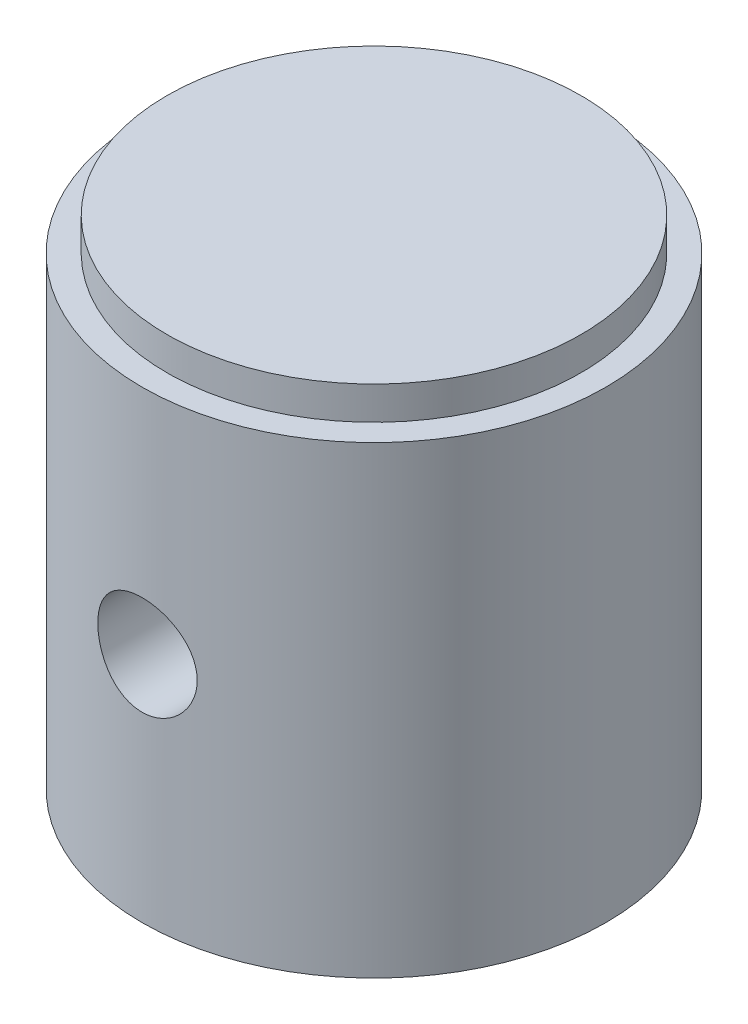
ISO-10303-21;
HEADER;
FILE_DESCRIPTION(('STEP AP214'),'2;1');
FILE_NAME('part.step','',(''),(''),'','','');
FILE_SCHEMA(('AUTOMOTIVE_DESIGN { 1 0 10303 214 1 1 1 1 }'));
ENDSEC;
DATA;
#1=APPLICATION_CONTEXT('core data for automotive mechanical design processes');
#2=APPLICATION_PROTOCOL_DEFINITION('international standard','automotive_design',2000,#1);
#3=PRODUCT_CONTEXT('',#1,'mechanical');
#4=PRODUCT('Part','Part','',(#3));
#5=PRODUCT_RELATED_PRODUCT_CATEGORY('part','',(#4));
#6=PRODUCT_DEFINITION_FORMATION('','',#4);
#7=PRODUCT_DEFINITION_CONTEXT('part definition',#1,'design');
#8=PRODUCT_DEFINITION('design','',#6,#7);
#9=PRODUCT_DEFINITION_SHAPE('','',#8);
#10=(LENGTH_UNIT() NAMED_UNIT(*) SI_UNIT(.MILLI.,.METRE.));
#11=(NAMED_UNIT(*) PLANE_ANGLE_UNIT() SI_UNIT($,.RADIAN.));
#12=(NAMED_UNIT(*) SI_UNIT($,.STERADIAN.) SOLID_ANGLE_UNIT());
#13=UNCERTAINTY_MEASURE_WITH_UNIT(LENGTH_MEASURE(1.E-05),#10,'distance_accuracy_value','');
#14=(GEOMETRIC_REPRESENTATION_CONTEXT(3) GLOBAL_UNCERTAINTY_ASSIGNED_CONTEXT((#13)) GLOBAL_UNIT_ASSIGNED_CONTEXT((#10,
#11,#12)) REPRESENTATION_CONTEXT('',''));
#15=CARTESIAN_POINT('',(0.,0.,0.));
#16=DIRECTION('',(0.,0.,1.));
#17=DIRECTION('',(1.,0.,0.));
#18=AXIS2_PLACEMENT_3D('',#15,#16,#17);
#19=CARTESIAN_POINT('',(0.,1.14591205961906,0.));
#20=DIRECTION('',(0.,1.,0.));
#21=DIRECTION('',(-1.,0.,0.));
#22=AXIS2_PLACEMENT_3D('',#19,#20,#21);
#23=PLANE('',#22);
#24=CARTESIAN_POINT('',(0.,1.14591205961906,0.));
#25=DIRECTION('',(0.,1.,0.));
#26=DIRECTION('',(-1.,0.,0.));
#27=AXIS2_PLACEMENT_3D('',#24,#25,#26);
#28=CIRCLE('',#27,6.25);
#29=CARTESIAN_POINT('',(-6.25,1.14591205961906,0.));
#30=VERTEX_POINT('',#29);
#31=EDGE_CURVE('E11',#30,#30,#28,.T.);
#32=ORIENTED_EDGE('',*,*,#31,.T.);
#33=EDGE_LOOP('',(#32));
#34=FACE_BOUND('',#33,.T.);
#35=ADVANCED_FACE('F39',(#34),#23,.T.);
#36=CARTESIAN_POINT('',(0.,1.14591205961906,0.));
#37=DIRECTION('',(0.,1.,0.));
#38=DIRECTION('',(-1.,0.,0.));
#39=AXIS2_PLACEMENT_3D('',#36,#37,#38);
#40=CYLINDRICAL_SURFACE('',#39,6.25);
#41=CARTESIAN_POINT('',(0.,0.145912059619058,0.));
#42=DIRECTION('',(0.,1.,0.));
#43=DIRECTION('',(-1.,0.,0.));
#44=AXIS2_PLACEMENT_3D('',#41,#42,#43);
#45=CIRCLE('',#44,6.25);
#46=CARTESIAN_POINT('',(-6.25,0.145912059619058,0.));
#47=VERTEX_POINT('',#46);
#48=EDGE_CURVE('E52',#47,#47,#45,.T.);
#49=ORIENTED_EDGE('',*,*,#48,.T.);
#50=EDGE_LOOP('',(#49));
#51=FACE_BOUND('',#50,.T.);
#52=ORIENTED_EDGE('',*,*,#31,.F.);
#53=EDGE_LOOP('',(#52));
#54=FACE_BOUND('',#53,.T.);
#55=ADVANCED_FACE('F127',(#51,#54),#40,.T.);
#56=CARTESIAN_POINT('',(-6.25,0.145912059619058,0.));
#57=DIRECTION('',(0.,1.,0.));
#58=DIRECTION('',(-1.,0.,0.));
#59=AXIS2_PLACEMENT_3D('',#56,#57,#58);
#60=PLANE('',#59);
#61=CARTESIAN_POINT('',(0.,0.145912059619058,0.));
#62=DIRECTION('',(0.,1.,0.));
#63=DIRECTION('',(-1.,0.,0.));
#64=AXIS2_PLACEMENT_3D('',#61,#62,#63);
#65=CIRCLE('',#64,7.);
#66=CARTESIAN_POINT('',(-7.,0.145912059619058,0.));
#67=VERTEX_POINT('',#66);
#68=EDGE_CURVE('E91',#67,#67,#65,.T.);
#69=ORIENTED_EDGE('',*,*,#68,.T.);
#70=EDGE_LOOP('',(#69));
#71=FACE_BOUND('',#70,.T.);
#72=ORIENTED_EDGE('',*,*,#48,.F.);
#73=EDGE_LOOP('',(#72));
#74=FACE_BOUND('',#73,.T.);
#75=ADVANCED_FACE('F123',(#71,#74),#60,.T.);
#76=CARTESIAN_POINT('',(0.,1.14591205961906,0.));
#77=DIRECTION('',(0.,1.,0.));
#78=DIRECTION('',(-1.,0.,0.));
#79=AXIS2_PLACEMENT_3D('',#76,#77,#78);
#80=CYLINDRICAL_SURFACE('',#79,7.);
#81=CARTESIAN_POINT('',(0.,-5.35408794038094,-7.));
#82=CARTESIAN_POINT('',(0.0832358860906173,-5.35409083995524,-6.99999846043226));
#83=CARTESIAN_POINT('',(0.166507195600275,-5.3610395487688,-6.9985002594971));
#84=CARTESIAN_POINT('',(0.330687344293328,-5.38862359723453,-6.99266829827728));
#85=CARTESIAN_POINT('',(0.411594403571191,-5.40926898457588,-6.98833245637099));
#86=CARTESIAN_POINT('',(0.568649323817737,-5.46357230498898,-6.97730831788826));
#87=CARTESIAN_POINT('',(0.644801963446556,-5.49721691976226,-6.97062242967171));
#88=CARTESIAN_POINT('',(0.790378177960787,-5.57652202655221,-6.95562106817971));
#89=CARTESIAN_POINT('',(0.85980198174737,-5.62218210963088,-6.94730565036661));
#90=CARTESIAN_POINT('',(0.99102479053523,-5.72496824005445,-6.92981369246311));
#91=CARTESIAN_POINT('',(1.05270503419445,-5.78224416227947,-6.92062683143259));
#92=CARTESIAN_POINT('',(1.16566042389435,-5.90631425606614,-6.90250069814144));
#93=CARTESIAN_POINT('',(1.21693467150908,-5.9731092486322,-6.8935614473163));
#94=CARTESIAN_POINT('',(1.30814204379809,-6.11519369324137,-6.87684116047225));
#95=CARTESIAN_POINT('',(1.34794958335009,-6.19056545813715,-6.8690733634436));
#96=CARTESIAN_POINT('',(1.41428823691148,-6.34712239414778,-6.85572325558537));
#97=CARTESIAN_POINT('',(1.44082087001716,-6.42830689887351,-6.85014069470711));
#98=CARTESIAN_POINT('',(1.47946574422454,-6.59289902696902,-6.84189808926311));
#99=CARTESIAN_POINT('',(1.49178779748342,-6.67625521604481,-6.83919556896486));
#100=CARTESIAN_POINT('',(1.50231395206577,-6.84389217288794,-6.83689139845106));
#101=CARTESIAN_POINT('',(1.50051971664629,-6.92817283056089,-6.83728938291729));
#102=CARTESIAN_POINT('',(1.48303326340861,-7.09371262831473,-6.84110276603832));
#103=CARTESIAN_POINT('',(1.46758398649408,-7.17499882948109,-6.84446541682162));
#104=CARTESIAN_POINT('',(1.42361054298677,-7.33379818067028,-6.85374593375788));
#105=CARTESIAN_POINT('',(1.39508566936466,-7.41131112641326,-6.85966393808402));
#106=CARTESIAN_POINT('',(1.32554551075991,-7.56105081325428,-6.87344080755724));
#107=CARTESIAN_POINT('',(1.2844361097283,-7.63323245309349,-6.88131420983365));
#108=CARTESIAN_POINT('',(1.19096007283993,-7.7697631053389,-6.89810572501288));
#109=CARTESIAN_POINT('',(1.13859196103562,-7.83411108906714,-6.90702397481896));
#110=CARTESIAN_POINT('',(1.0227954275532,-7.95454729605434,-6.92512718393878));
#111=CARTESIAN_POINT('',(0.959160233964409,-8.01043664696568,-6.93431383972178));
#112=CARTESIAN_POINT('',(0.823317306269096,-8.1107816740706,-6.95175017497059));
#113=CARTESIAN_POINT('',(0.751109428775399,-8.15523715898133,-6.95999983875972));
#114=CARTESIAN_POINT('',(0.599933462049958,-8.23149862028787,-6.97465778534003));
#115=CARTESIAN_POINT('',(0.520952258863481,-8.26327935295892,-6.98106238643354));
#116=CARTESIAN_POINT('',(0.358603146685705,-8.31306358870203,-6.99128109245334));
#117=CARTESIAN_POINT('',(0.275235851133668,-8.33106901294426,-6.99509555860384));
#118=CARTESIAN_POINT('',(0.108187670836628,-8.35250415452437,-6.99965306347808));
#119=CARTESIAN_POINT('',(0.0245431772716139,-8.35620565326272,-7.00045336521066));
#120=CARTESIAN_POINT('',(-0.142168973650405,-8.34966336925578,-6.99905248935969));
#121=CARTESIAN_POINT('',(-0.225236668127256,-8.339420492418,-6.99685150675698));
#122=CARTESIAN_POINT('',(-0.387542537982806,-8.30550569671924,-6.98973143045266));
#123=CARTESIAN_POINT('',(-0.466811712908478,-8.28197557090841,-6.9848410504546));
#124=CARTESIAN_POINT('',(-0.620278450473418,-8.22231099738612,-6.9728892442151));
#125=CARTESIAN_POINT('',(-0.69447559258774,-8.18617550606929,-6.96582763822237));
#126=CARTESIAN_POINT('',(-0.836821397964754,-8.10175439732062,-6.950175043904));
#127=CARTESIAN_POINT('',(-0.904872575111141,-8.05330814547121,-6.94156431354275));
#128=CARTESIAN_POINT('',(-1.0319769255236,-7.9458531154922,-6.92381033034847));
#129=CARTESIAN_POINT('',(-1.091028978692,-7.8868430244935,-6.91466701142097));
#130=CARTESIAN_POINT('',(-1.19952711057989,-7.7586905701938,-6.89668172706324));
#131=CARTESIAN_POINT('',(-1.24878537255156,-7.68938784115884,-6.88784792221285));
#132=CARTESIAN_POINT('',(-1.3349641538604,-7.54333334390295,-6.87166654559681));
#133=CARTESIAN_POINT('',(-1.37188519913706,-7.46658189340345,-6.86431891048055));
#134=CARTESIAN_POINT('',(-1.43209741248548,-7.30821564138634,-6.8520100980739));
#135=CARTESIAN_POINT('',(-1.45546398641275,-7.22663058395027,-6.84703574582967));
#136=CARTESIAN_POINT('',(-1.48812696085335,-7.0605723565473,-6.84001186708418));
#137=CARTESIAN_POINT('',(-1.49742550780258,-6.97609962917962,-6.83796189439706));
#138=CARTESIAN_POINT('',(-1.5015999992604,-6.8085555972057,-6.83704618848156));
#139=CARTESIAN_POINT('',(-1.49677347258311,-6.72549192540036,-6.83811476518543));
#140=CARTESIAN_POINT('',(-1.47349789406331,-6.56139069824835,-6.8431676318483));
#141=CARTESIAN_POINT('',(-1.45504898957979,-6.48035312099437,-6.84715189026714));
#142=CARTESIAN_POINT('',(-1.40519345940434,-6.32282928251177,-6.85755581104157));
#143=CARTESIAN_POINT('',(-1.37382847170887,-6.24632929171665,-6.86396764224703));
#144=CARTESIAN_POINT('',(-1.29906751595601,-6.09963256787409,-6.87850764590649));
#145=CARTESIAN_POINT('',(-1.255670353015,-6.0294364617659,-6.88663598880363));
#146=CARTESIAN_POINT('',(-1.15708290349304,-5.89586974665557,-6.90389055593232));
#147=CARTESIAN_POINT('',(-1.10167987421236,-5.83265824443396,-6.91303309938926));
#148=CARTESIAN_POINT('',(-0.981086554619619,-5.71633167786048,-6.93117449799694));
#149=CARTESIAN_POINT('',(-0.915894009385595,-5.66321894606873,-6.94017331951296));
#150=CARTESIAN_POINT('',(-0.776603147268716,-5.56797198087538,-6.95714491048987));
#151=CARTESIAN_POINT('',(-0.702404846009641,-5.52598133414996,-6.96510364570626));
#152=CARTESIAN_POINT('',(-0.547850160940598,-5.45513341147476,-6.97895826104019));
#153=CARTESIAN_POINT('',(-0.467499105863879,-5.42626491779591,-6.98485590212343));
#154=CARTESIAN_POINT('',(-0.322535217553203,-5.38773575524979,-6.99284848461772));
#155=CARTESIAN_POINT('',(-0.258717205545978,-5.37514150640091,-6.99551391888263));
#156=CARTESIAN_POINT('',(-0.129939960853845,-5.35831663866927,-6.99909024154719));
#157=CARTESIAN_POINT('',(-0.0649807750887441,-5.35408567673488,-7.00000120191314));
#158=CARTESIAN_POINT('',(0.,-5.35408794038094,-7.));
#159=B_SPLINE_CURVE_WITH_KNOTS('',3,(#81,#82,#83,#84,#85,#86,#87,#88,#89,#90,#91,#92,#93,#94,
#95,#96,#97,#98,#99,#100,#101,#102,#103,#104,#105,#106,#107,#108,#109,#110,#111,#112,#113,#114,
#115,#116,#117,#118,#119,#120,#121,#122,#123,#124,#125,#126,#127,#128,#129,#130,#131,#132,#133,
#134,#135,#136,#137,#138,#139,#140,#141,#142,#143,#144,#145,#146,#147,#148,#149,#150,#151,#152,
#153,#154,#155,#156,#157,#158),.UNSPECIFIED.,.T.,.F.,(4,2,2,2,2,2,2,2,2,2,2,2,2,2,2,2,2,2,2,2,2,
2,2,2,2,2,2,2,2,2,2,2,2,2,2,2,2,2,4),(0.,0.249469836512082,0.499122883219936,0.748520824425602,
0.997910278645886,1.25074961881732,1.50361077918506,1.7591442921451,2.0146485567749,
2.26633008124666,2.51798195169165,2.76524475452927,3.01252092904568,3.26169356165968,
3.51089887920889,3.76527011050291,4.0196455970235,4.27452521139806,4.52936927256343,
4.77934665704185,5.02930780231429,5.27665060589267,5.52401389198434,5.77478733867803,
6.02559197304485,6.28082063283534,6.53603841075806,6.78982240408475,7.04356767229185,
7.29200680540294,7.5404432510827,7.78808499706785,8.03575134451623,8.28822950154114,
8.54076590397115,8.79641910357222,9.05185334010271,9.24661799132294,9.44137465337336),.UNSPECIFIED.);
#160=CARTESIAN_POINT('',(0.,-5.35408794038094,-7.));
#161=VERTEX_POINT('',#160);
#162=EDGE_CURVE('E68',#161,#161,#159,.T.);
#163=ORIENTED_EDGE('',*,*,#162,.F.);
#164=EDGE_LOOP('',(#163));
#165=FACE_BOUND('',#164,.T.);
#166=CARTESIAN_POINT('',(1.5,-6.85408794038094,6.83739716558867));
#167=CARTESIAN_POINT('',(1.49999708238613,-6.77087678789899,6.83739884558951));
#168=CARTESIAN_POINT('',(1.49305236244768,-6.68763016643882,6.83893272341929));
#169=CARTESIAN_POINT('',(1.46548559252999,-6.52350126813893,6.84489178429867));
#170=CARTESIAN_POINT('',(1.44485339653622,-6.44262079170474,6.84931911211841));
#171=CARTESIAN_POINT('',(1.39058863684599,-6.28562219080674,6.86054115293409));
#172=CARTESIAN_POINT('',(1.35697000991314,-6.20949906225948,6.86733332725825));
#173=CARTESIAN_POINT('',(1.27772617673341,-6.06397266643633,6.88251670848644));
#174=CARTESIAN_POINT('',(1.23210132048776,-5.99456920335186,6.89090786877545));
#175=CARTESIAN_POINT('',(1.12935142570221,-5.86332497889882,6.90849578796654));
#176=CARTESIAN_POINT('',(1.07206859483983,-5.80160906414098,6.91770249871754));
#177=CARTESIAN_POINT('',(0.947969508129577,-5.68858438597516,6.93579691710397));
#178=CARTESIAN_POINT('',(0.881152530217676,-5.63727641152087,6.94468460051417));
#179=CARTESIAN_POINT('',(0.739047288464581,-5.54603249588951,6.96124769109432));
#180=CARTESIAN_POINT('',(0.663680488229953,-5.50621628461032,6.96890998819429));
#181=CARTESIAN_POINT('',(0.507134269342595,-5.43986024893465,6.98204671042934));
#182=CARTESIAN_POINT('',(0.425955477380312,-5.41331899559466,6.98752137103329));
#183=CARTESIAN_POINT('',(0.261387187671512,-5.3746579694496,6.9955956528118));
#184=CARTESIAN_POINT('',(0.178049400596923,-5.36232701182851,6.99823733378385));
#185=CARTESIAN_POINT('',(0.0104489453066445,-5.35177666306768,7.00049362207002));
#186=CARTESIAN_POINT('',(-0.0738136201647594,-5.35355571982018,7.00010856232698));
#187=CARTESIAN_POINT('',(-0.239417029250512,-5.37101690504452,6.99638700862558));
#188=CARTESIAN_POINT('',(-0.320783115362113,-5.38647144067086,6.99309883152432));
#189=CARTESIAN_POINT('',(-0.479739463978389,-5.4304826222328,6.98399541589104));
#190=CARTESIAN_POINT('',(-0.557329560175054,-5.45903984468068,6.97818006616518));
#191=CARTESIAN_POINT('',(-0.707167497556553,-5.52864939926946,6.96459754646858));
#192=CARTESIAN_POINT('',(-0.779373657015789,-5.56978870758529,6.95681685803946));
#193=CARTESIAN_POINT('',(-0.915940926562847,-5.66332990854454,6.94015793743865));
#194=CARTESIAN_POINT('',(-0.980301006451529,-5.71573327768124,6.93127956144693));
#195=CARTESIAN_POINT('',(-1.10070208800198,-5.83155648490881,6.91319326460925));
#196=CARTESIAN_POINT('',(-1.1565511732025,-5.89517551973798,6.90398230372853));
#197=CARTESIAN_POINT('',(-1.25682243234728,-6.03097122544945,6.88643566831974));
#198=CARTESIAN_POINT('',(-1.30124432118068,-6.10314810978619,6.87810001563386));
#199=CARTESIAN_POINT('',(-1.37748077573296,-6.2543124414447,6.86324023586723));
#200=CARTESIAN_POINT('',(-1.40926035088923,-6.33331806423338,6.85672115127775));
#201=CARTESIAN_POINT('',(-1.45903495159115,-6.49572070632738,6.84630340806617));
#202=CARTESIAN_POINT('',(-1.47703206694628,-6.57911705782413,6.84240435218483));
#203=CARTESIAN_POINT('',(-1.49843586024652,-6.74618369303066,6.83774881255446));
#204=CARTESIAN_POINT('',(-1.5021214192864,-6.82981661545825,6.83693227051701));
#205=CARTESIAN_POINT('',(-1.49555139642373,-6.99650193356264,6.83837239573994));
#206=CARTESIAN_POINT('',(-1.48529673081635,-7.07955436703449,6.84062886101063));
#207=CARTESIAN_POINT('',(-1.45137894635584,-7.2417583753617,6.84790415484206));
#208=CARTESIAN_POINT('',(-1.42786830251553,-7.3209433729779,6.85289155274364));
#209=CARTESIAN_POINT('',(-1.36827052946749,-7.47425027791386,6.86503859869777));
#210=CARTESIAN_POINT('',(-1.33218223662818,-7.54837171601513,6.87219844772849));
#211=CARTESIAN_POINT('',(-1.24783504416705,-7.69065762513986,6.88801634080345));
#212=CARTESIAN_POINT('',(-1.19940368590792,-7.75871752239313,6.89669501746317));
#213=CARTESIAN_POINT('',(-1.091971838336,-7.88584628625474,6.91451775360139));
#214=CARTESIAN_POINT('',(-1.03297009182161,-7.94491408182941,6.92366186834461));
#215=CARTESIAN_POINT('',(-0.904812764420813,-8.0534582433257,6.94158239990173));
#216=CARTESIAN_POINT('',(-0.835494925828769,-8.10274485653795,6.95034935607746));
#217=CARTESIAN_POINT('',(-0.689401481282275,-8.18897334973199,6.96635610714901));
#218=CARTESIAN_POINT('',(-0.612626216043738,-8.22591579335377,6.97359597176692));
#219=CARTESIAN_POINT('',(-0.454265418982039,-8.28613999501942,6.98569278381574));
#220=CARTESIAN_POINT('',(-0.372713193075171,-8.30950624412722,6.99056443803698));
#221=CARTESIAN_POINT('',(-0.206725177003288,-8.34217964611326,6.9974393930198));
#222=CARTESIAN_POINT('',(-0.122289789973992,-8.35148875635485,6.99944309312296));
#223=CARTESIAN_POINT('',(0.0452637170528296,-8.3556985927928,7.00034511009057));
#224=CARTESIAN_POINT('',(0.12837450550923,-8.35088309898556,6.99930459001667));
#225=CARTESIAN_POINT('',(0.292572938415961,-8.32761317686191,6.99436552363383));
#226=CARTESIAN_POINT('',(0.373660616405286,-8.30915897480262,6.99046702473686));
#227=CARTESIAN_POINT('',(0.53130194848727,-8.25926913413145,6.98025388638537));
#228=CARTESIAN_POINT('',(0.607868365073178,-8.22787225099538,6.97394646430493));
#229=CARTESIAN_POINT('',(0.75468495672322,-8.15302666921182,6.95959036050661));
#230=CARTESIAN_POINT('',(0.824934544796142,-8.10957685207491,6.9515415172034));
#231=CARTESIAN_POINT('',(0.958512306895244,-8.01092562163827,6.93439809934493));
#232=CARTESIAN_POINT('',(1.02169036510577,-7.95552378205963,6.92528708907874));
#233=CARTESIAN_POINT('',(1.13795001457643,-7.83494733013059,6.90713690075836));
#234=CARTESIAN_POINT('',(1.19102918062422,-7.76977037702533,6.89809774045682));
#235=CARTESIAN_POINT('',(1.28623261596675,-7.63049744719526,6.88098693651916));
#236=CARTESIAN_POINT('',(1.32820897809616,-7.55629858209392,6.87292905956533));
#237=CARTESIAN_POINT('',(1.39903004659825,-7.40174421945769,6.85886497228049));
#238=CARTESIAN_POINT('',(1.42788606423931,-7.32139409512787,6.85285699581573));
#239=CARTESIAN_POINT('',(1.46638607121558,-7.17646180919508,6.84470560641996));
#240=CARTESIAN_POINT('',(1.47896752507743,-7.11267626467311,6.84198283087953));
#241=CARTESIAN_POINT('',(1.49577544043437,-6.98396362880362,6.83832799504406));
#242=CARTESIAN_POINT('',(1.50000227727981,-6.91903658887262,6.83739585430069));
#243=CARTESIAN_POINT('',(1.5,-6.85408794038094,6.83739716558867));
#244=B_SPLINE_CURVE_WITH_KNOTS('',3,(#166,#167,#168,#169,#170,#171,#172,#173,#174,#175,#176,
#177,#178,#179,#180,#181,#182,#183,#184,#185,#186,#187,#188,#189,#190,#191,#192,#193,#194,#195,
#196,#197,#198,#199,#200,#201,#202,#203,#204,#205,#206,#207,#208,#209,#210,#211,#212,#213,#214,
#215,#216,#217,#218,#219,#220,#221,#222,#223,#224,#225,#226,#227,#228,#229,#230,#231,#232,#233,
#234,#235,#236,#237,#238,#239,#240,#241,#242,#243),.UNSPECIFIED.,.T.,.F.,(4,2,2,2,2,2,2,2,2,2,2,
2,2,2,2,2,2,2,2,2,2,2,2,2,2,2,2,2,2,2,2,2,2,2,2,2,2,2,4),(0.,0.249395482027528,
0.498976038479964,0.748289491152759,0.997595676735284,1.25053229582692,1.50348808112879,
1.75899134820278,2.01446710646268,2.26609508151929,2.51769537777241,2.76518557667372,
3.01268666607584,3.26193888143437,3.51122378872315,3.76548960779295,4.01976177023092,
4.27473287411781,4.52966530953839,4.77960433192523,5.02952692653917,5.27663180749375,
5.5237595556315,5.77455010216318,6.02537049659078,6.28066214683211,6.53594213875542,
6.78961589824376,7.04325433208539,7.29183199644127,7.540405537151,7.78824009619483,
8.03609766151366,8.28848914160965,8.54094115631233,8.79660380167249,9.05204561611688,
9.24671456122272,9.44137476018023),.UNSPECIFIED.);
#245=CARTESIAN_POINT('',(1.5,-6.85408794038094,6.83739716558867));
#246=VERTEX_POINT('',#245);
#247=EDGE_CURVE('E76',#246,#246,#244,.T.);
#248=ORIENTED_EDGE('',*,*,#247,.F.);
#249=EDGE_LOOP('',(#248));
#250=FACE_BOUND('',#249,.T.);
#251=CARTESIAN_POINT('',(0.,-13.8540879403809,0.));
#252=DIRECTION('',(0.,1.,0.));
#253=DIRECTION('',(-1.,0.,0.));
#254=AXIS2_PLACEMENT_3D('',#251,#252,#253);
#255=CIRCLE('',#254,7.);
#256=CARTESIAN_POINT('',(-7.,-13.8540879403809,0.));
#257=VERTEX_POINT('',#256);
#258=EDGE_CURVE('E87',#257,#257,#255,.T.);
#259=ORIENTED_EDGE('',*,*,#258,.T.);
#260=EDGE_LOOP('',(#259));
#261=FACE_BOUND('',#260,.T.);
#262=ORIENTED_EDGE('',*,*,#68,.F.);
#263=EDGE_LOOP('',(#262));
#264=FACE_BOUND('',#263,.T.);
#265=ADVANCED_FACE('F117',(#165,#250,#261,#264),#80,.T.);
#266=CARTESIAN_POINT('',(-7.,-13.8540879403809,0.));
#267=DIRECTION('',(0.,-1.,0.));
#268=DIRECTION('',(1.,0.,0.));
#269=AXIS2_PLACEMENT_3D('',#266,#267,#268);
#270=PLANE('',#269);
#271=CARTESIAN_POINT('',(0.,-13.8540879403809,0.));
#272=DIRECTION('',(0.,1.,0.));
#273=DIRECTION('',(-1.,0.,0.));
#274=AXIS2_PLACEMENT_3D('',#271,#272,#273);
#275=CIRCLE('',#274,6.25);
#276=CARTESIAN_POINT('',(-6.25,-13.8540879403809,0.));
#277=VERTEX_POINT('',#276);
#278=EDGE_CURVE('E73',#277,#277,#275,.T.);
#279=ORIENTED_EDGE('',*,*,#278,.T.);
#280=EDGE_LOOP('',(#279));
#281=FACE_BOUND('',#280,.T.);
#282=ORIENTED_EDGE('',*,*,#258,.F.);
#283=EDGE_LOOP('',(#282));
#284=FACE_BOUND('',#283,.T.);
#285=ADVANCED_FACE('F122',(#281,#284),#270,.T.);
#286=CARTESIAN_POINT('',(0.,-13.8540879403809,0.));
#287=DIRECTION('',(0.,-1.,0.));
#288=DIRECTION('',(1.,0.,0.));
#289=AXIS2_PLACEMENT_3D('',#286,#287,#288);
#290=CONICAL_SURFACE('',#289,6.25,0.349065850398867);
#291=CARTESIAN_POINT('',(0.,-9.73287181119901,0.));
#292=DIRECTION('',(0.,1.,0.));
#293=DIRECTION('',(-1.,0.,0.));
#294=AXIS2_PLACEMENT_3D('',#291,#292,#293);
#295=CIRCLE('',#294,4.75);
#296=CARTESIAN_POINT('',(-4.75,-9.73287181119901,0.));
#297=VERTEX_POINT('',#296);
#298=EDGE_CURVE('E67',#297,#297,#295,.T.);
#299=ORIENTED_EDGE('',*,*,#298,.T.);
#300=EDGE_LOOP('',(#299));
#301=FACE_BOUND('',#300,.T.);
#302=ORIENTED_EDGE('',*,*,#278,.F.);
#303=EDGE_LOOP('',(#302));
#304=FACE_BOUND('',#303,.T.);
#305=ADVANCED_FACE('F161',(#301,#304),#290,.F.);
#306=CARTESIAN_POINT('',(0.,1.14591205961906,0.));
#307=DIRECTION('',(0.,1.,0.));
#308=DIRECTION('',(-1.,0.,0.));
#309=AXIS2_PLACEMENT_3D('',#306,#307,#308);
#310=CYLINDRICAL_SURFACE('',#309,4.75);
#311=CARTESIAN_POINT('',(1.5,-6.85408794038094,-4.50693909432999));
#312=CARTESIAN_POINT('',(1.49999958004515,-6.7721196577048,-4.50693949515469));
#313=CARTESIAN_POINT('',(1.49325840231682,-6.6901469566562,-4.50919970874085));
#314=CARTESIAN_POINT('',(1.46655104887094,-6.52861293088149,-4.5179553253781));
#315=CARTESIAN_POINT('',(1.44658152131253,-6.44905222265826,-4.52445180182028));
#316=CARTESIAN_POINT('',(1.39417508352591,-6.29470573753141,-4.54087234787262));
#317=CARTESIAN_POINT('',(1.36176059537411,-6.21991165356943,-4.55079024986066));
#318=CARTESIAN_POINT('',(1.28545946652237,-6.07680188437629,-4.57292751994247));
#319=CARTESIAN_POINT('',(1.24157071835092,-6.00848739239298,-4.58514731070763));
#320=CARTESIAN_POINT('',(1.14191784971278,-5.87787926892888,-4.6109923380212));
#321=CARTESIAN_POINT('',(1.08582030493755,-5.81584637664503,-4.62464992232587));
#322=CARTESIAN_POINT('',(0.964055421977067,-5.70189358755743,-4.65155671093151));
#323=CARTESIAN_POINT('',(0.89838672023377,-5.6499751341773,-4.66480585671778));
#324=CARTESIAN_POINT('',(0.757464836701734,-5.55656943425556,-4.68977365915903));
#325=CARTESIAN_POINT('',(0.682025001056137,-5.51535142867759,-4.70144979545653));
#326=CARTESIAN_POINT('',(0.524852067423557,-5.44629068315636,-4.72157773016224));
#327=CARTESIAN_POINT('',(0.443120487221091,-5.41844472907479,-4.73003030329318));
#328=CARTESIAN_POINT('',(0.278414775826808,-5.37779120927982,-4.74252974850081));
#329=CARTESIAN_POINT('',(0.195560751143444,-5.36453783892489,-4.74670693307633));
#330=CARTESIAN_POINT('',(0.0287067286102963,-5.35203243628337,-4.75064554540298));
#331=CARTESIAN_POINT('',(-0.055292998869421,-5.35277715587087,-4.75040799755164));
#332=CARTESIAN_POINT('',(-0.218913619351865,-5.36795513993682,-4.74563427350171));
#333=CARTESIAN_POINT('',(-0.298584494979865,-5.38190499009779,-4.74124990899214));
#334=CARTESIAN_POINT('',(-0.45439031175481,-5.42230309803136,-4.72886249486103));
#335=CARTESIAN_POINT('',(-0.530525020335842,-5.44875217657593,-4.72085920760149));
#336=CARTESIAN_POINT('',(-0.678203652675079,-5.51370412226577,-4.7019310355991));
#337=CARTESIAN_POINT('',(-0.74967901329581,-5.55235226805692,-4.69097118266663));
#338=CARTESIAN_POINT('',(-0.885279102378908,-5.64048825496808,-4.66728249867119));
#339=CARTESIAN_POINT('',(-0.949401935733848,-5.68997888120319,-4.65455321340063));
#340=CARTESIAN_POINT('',(-1.07135837440922,-5.80086990661586,-4.62803989727125));
#341=CARTESIAN_POINT('',(-1.12880871974839,-5.86268717443352,-4.61423403233704));
#342=CARTESIAN_POINT('',(-1.23264301054731,-5.99520609936009,-4.58758892442481));
#343=CARTESIAN_POINT('',(-1.2790255944206,-6.06590884795354,-4.57474980051078));
#344=CARTESIAN_POINT('',(-1.35986638692084,-6.21529471221219,-4.55138024059369));
#345=CARTESIAN_POINT('',(-1.39417963639867,-6.29406107899704,-4.54087839223385));
#346=CARTESIAN_POINT('',(-1.44893342452635,-6.45666604209655,-4.5237069894911));
#347=CARTESIAN_POINT('',(-1.46937907304313,-6.54050275769758,-4.5170360236621));
#348=CARTESIAN_POINT('',(-1.49507161979024,-6.70719030070485,-4.5085959379324));
#349=CARTESIAN_POINT('',(-1.50090655288536,-6.78994094405971,-4.50663729609299));
#350=CARTESIAN_POINT('',(-1.49886513965521,-6.95524565634742,-4.50731687465407));
#351=CARTESIAN_POINT('',(-1.49099096720734,-7.03779975436821,-4.50995436623754));
#352=CARTESIAN_POINT('',(-1.46228084598241,-7.19781462827841,-4.51934163323601));
#353=CARTESIAN_POINT('',(-1.4418371919129,-7.27535386104789,-4.5259668251803));
#354=CARTESIAN_POINT('',(-1.38903056686353,-7.42589187285975,-4.54245022183902));
#355=CARTESIAN_POINT('',(-1.35666562487664,-7.49888989874716,-4.55230896114271));
#356=CARTESIAN_POINT('',(-1.2798587413425,-7.64062964410245,-4.57450539166733));
#357=CARTESIAN_POINT('',(-1.2350921421442,-7.7091851686548,-4.58690698850856));
#358=CARTESIAN_POINT('',(-1.13512998682984,-7.83802498613951,-4.61266077618539));
#359=CARTESIAN_POINT('',(-1.07993166463934,-7.89830707795434,-4.62601321856053));
#360=CARTESIAN_POINT('',(-0.957886037531119,-8.01152971698893,-4.65285013455169));
#361=CARTESIAN_POINT('',(-0.890643665109767,-8.06404992326935,-4.66631614662306));
#362=CARTESIAN_POINT('',(-0.747973360630615,-8.15707924857227,-4.6912975579683));
#363=CARTESIAN_POINT('',(-0.672545793179842,-8.19758890230142,-4.70281304406929));
#364=CARTESIAN_POINT('',(-0.516099288450846,-8.26506030291257,-4.72253168708172));
#365=CARTESIAN_POINT('',(-0.435125281433141,-8.29211897216546,-4.73075845435933));
#366=CARTESIAN_POINT('',(-0.269469399491867,-8.33214098472394,-4.7430763734001));
#367=CARTESIAN_POINT('',(-0.184788721002361,-8.34510884184619,-4.74716884950256));
#368=CARTESIAN_POINT('',(-0.0179886485878237,-8.3562082436468,-4.7506674317259));
#369=CARTESIAN_POINT('',(0.0640868361538652,-8.35494634309597,-4.75026513795577));
#370=CARTESIAN_POINT('',(0.226803220963033,-8.33909339504489,-4.74528029002945));
#371=CARTESIAN_POINT('',(0.307444217580878,-8.32450324810922,-4.74069801830655));
#372=CARTESIAN_POINT('',(0.4639698367645,-8.28279688043806,-4.72793024704182));
#373=CARTESIAN_POINT('',(0.539902672774311,-8.25584600763334,-4.71979237633648));
#374=CARTESIAN_POINT('',(0.686204345183072,-8.19033308378633,-4.70075227796056));
#375=CARTESIAN_POINT('',(0.756572215112848,-8.15176902144508,-4.68984957149724));
#376=CARTESIAN_POINT('',(0.892382156713933,-8.06259062090747,-4.66594837362514));
#377=CARTESIAN_POINT('',(0.957571386267192,-8.01160726897528,-4.65289067194133));
#378=CARTESIAN_POINT('',(1.07867009763973,-7.89968472788248,-4.62631837968684));
#379=CARTESIAN_POINT('',(1.13457676425287,-7.83874252949153,-4.61280365200012));
#380=CARTESIAN_POINT('',(1.23744612372159,-7.7061464976088,-4.58630016066439));
#381=CARTESIAN_POINT('',(1.28403955823579,-7.63419864212287,-4.5733449634976));
#382=CARTESIAN_POINT('',(1.36442560849337,-7.48310188366027,-4.55001145096037));
#383=CARTESIAN_POINT('',(1.39822313048985,-7.40395575513592,-4.5396321484584));
#384=CARTESIAN_POINT('',(1.44974900503547,-7.2471414878097,-4.52342799882926));
#385=CARTESIAN_POINT('',(1.46853682069789,-7.16985149452304,-4.51730787458817));
#386=CARTESIAN_POINT('',(1.4936609032698,-7.01307131452837,-4.50906374742014));
#387=CARTESIAN_POINT('',(1.50000040727695,-6.93358170526922,-4.50693870560567));
#388=CARTESIAN_POINT('',(1.5,-6.85408794038094,-4.50693909432999));
#389=B_SPLINE_CURVE_WITH_KNOTS('',3,(#311,#312,#313,#314,#315,#316,#317,#318,#319,#320,#321,
#322,#323,#324,#325,#326,#327,#328,#329,#330,#331,#332,#333,#334,#335,#336,#337,#338,#339,#340,
#341,#342,#343,#344,#345,#346,#347,#348,#349,#350,#351,#352,#353,#354,#355,#356,#357,#358,#359,
#360,#361,#362,#363,#364,#365,#366,#367,#368,#369,#370,#371,#372,#373,#374,#375,#376,#377,#378,
#379,#380,#381,#382,#383,#384,#385,#386,#387,#388),.UNSPECIFIED.,.T.,.F.,(4,2,2,2,2,2,2,2,2,2,2,
2,2,2,2,2,2,2,2,2,2,2,2,2,2,2,2,2,2,2,2,2,2,2,2,2,2,2,4),(0.,0.245611090579273,
0.491284438685785,0.736517218845768,0.981795072467575,1.23487733964253,1.48799569757339,
1.74697244897189,2.00588692090239,2.25665093580603,2.50735676398231,2.74922580012767,
2.99111072100683,3.23599243602231,3.48093712787276,3.7362950135404,3.99168429786021,
4.25004385973256,4.50830817072249,4.75599786818586,5.00364829262799,5.24393641423545,
5.48426428174336,5.73160040316639,5.97900220045884,6.23690747266809,6.49480126127746,
6.75080881416402,7.0067343340116,7.25179355317672,7.49683621537552,7.73869250201122,
7.9805907000726,8.2308132702795,8.48111158966217,8.73993055878101,8.99865018989115,
9.23690856092584,9.47510496630383),.UNSPECIFIED.);
#390=CARTESIAN_POINT('',(1.5,-6.85408794038094,-4.50693909432999));
#391=VERTEX_POINT('',#390);
#392=EDGE_CURVE('E42',#391,#391,#389,.T.);
#393=ORIENTED_EDGE('',*,*,#392,.F.);
#394=EDGE_LOOP('',(#393));
#395=FACE_BOUND('',#394,.T.);
#396=CARTESIAN_POINT('',(1.5,-6.85408794038094,4.50693909432999));
#397=CARTESIAN_POINT('',(1.49999958004515,-6.93605622305708,4.50693949515469));
#398=CARTESIAN_POINT('',(1.49325840231682,-7.01802892410568,4.50919970874085));
#399=CARTESIAN_POINT('',(1.46655104887094,-7.17956294988039,4.5179553253781));
#400=CARTESIAN_POINT('',(1.44658152131253,-7.25912365810362,4.52445180182028));
#401=CARTESIAN_POINT('',(1.39417508352591,-7.41347014323047,4.54087234787262));
#402=CARTESIAN_POINT('',(1.36176059537411,-7.48826422719245,4.55079024986066));
#403=CARTESIAN_POINT('',(1.28545946652237,-7.63137399638559,4.57292751994247));
#404=CARTESIAN_POINT('',(1.24157071835092,-7.69968848836891,4.58514731070763));
#405=CARTESIAN_POINT('',(1.14191784971278,-7.830296611833,4.6109923380212));
#406=CARTESIAN_POINT('',(1.08582030493755,-7.89232950411685,4.62464992232587));
#407=CARTESIAN_POINT('',(0.964055421977067,-8.00628229320445,4.65155671093151));
#408=CARTESIAN_POINT('',(0.89838672023377,-8.05820074658458,4.66480585671778));
#409=CARTESIAN_POINT('',(0.757464836701734,-8.15160644650632,4.68977365915903));
#410=CARTESIAN_POINT('',(0.682025001056138,-8.19282445208429,4.70144979545653));
#411=CARTESIAN_POINT('',(0.524852067423557,-8.26188519760552,4.72157773016224));
#412=CARTESIAN_POINT('',(0.443120487221091,-8.28973115168709,4.73003030329318));
#413=CARTESIAN_POINT('',(0.278414775826807,-8.33038467148206,4.74252974850081));
#414=CARTESIAN_POINT('',(0.195560751143444,-8.343638041837,4.74670693307633));
#415=CARTESIAN_POINT('',(0.0287067286102965,-8.35614344447851,4.75064554540298));
#416=CARTESIAN_POINT('',(-0.0552929988694205,-8.35539872489102,4.75040799755164));
#417=CARTESIAN_POINT('',(-0.218913619351864,-8.34022074082506,4.74563427350171));
#418=CARTESIAN_POINT('',(-0.298584494979865,-8.32627089066409,4.74124990899214));
#419=CARTESIAN_POINT('',(-0.454390311754809,-8.28587278273052,4.72886249486103));
#420=CARTESIAN_POINT('',(-0.530525020335841,-8.25942370418595,4.72085920760149));
#421=CARTESIAN_POINT('',(-0.678203652675078,-8.19447175849612,4.7019310355991));
#422=CARTESIAN_POINT('',(-0.74967901329581,-8.15582361270496,4.69097118266663));
#423=CARTESIAN_POINT('',(-0.885279102378908,-8.0676876257938,4.66728249867119));
#424=CARTESIAN_POINT('',(-0.949401935733848,-8.01819699955869,4.65455321340063));
#425=CARTESIAN_POINT('',(-1.07135837440922,-7.90730597414602,4.62803989727125));
#426=CARTESIAN_POINT('',(-1.12880871974839,-7.84548870632836,4.61423403233704));
#427=CARTESIAN_POINT('',(-1.23264301054731,-7.7129697814018,4.58758892442481));
#428=CARTESIAN_POINT('',(-1.2790255944206,-7.64226703280834,4.57474980051078));
#429=CARTESIAN_POINT('',(-1.35986638692084,-7.49288116854969,4.55138024059369));
#430=CARTESIAN_POINT('',(-1.39417963639867,-7.41411480176484,4.54087839223385));
#431=CARTESIAN_POINT('',(-1.44893342452635,-7.25150983866533,4.5237069894911));
#432=CARTESIAN_POINT('',(-1.46937907304313,-7.1676731230643,4.5170360236621));
#433=CARTESIAN_POINT('',(-1.49507161979024,-7.00098558005703,4.5085959379324));
#434=CARTESIAN_POINT('',(-1.50090655288536,-6.91823493670217,4.50663729609299));
#435=CARTESIAN_POINT('',(-1.49886513965521,-6.75293022441446,4.50731687465408));
#436=CARTESIAN_POINT('',(-1.49099096720734,-6.67037612639367,4.50995436623754));
#437=CARTESIAN_POINT('',(-1.46228084598242,-6.51036125248347,4.51934163323602));
#438=CARTESIAN_POINT('',(-1.4418371919129,-6.43282201971399,4.5259668251803));
#439=CARTESIAN_POINT('',(-1.38903056686353,-6.28228400790213,4.54245022183902));
#440=CARTESIAN_POINT('',(-1.35666562487664,-6.20928598201472,4.55230896114271));
#441=CARTESIAN_POINT('',(-1.2798587413425,-6.06754623665943,4.57450539166733));
#442=CARTESIAN_POINT('',(-1.2350921421442,-5.99899071210709,4.58690698850856));
#443=CARTESIAN_POINT('',(-1.13512998682984,-5.87015089462237,4.61266077618539));
#444=CARTESIAN_POINT('',(-1.07993166463934,-5.80986880280754,4.62601321856053));
#445=CARTESIAN_POINT('',(-0.957886037531118,-5.69664616377295,4.65285013455169));
#446=CARTESIAN_POINT('',(-0.890643665109766,-5.64412595749253,4.66631614662306));
#447=CARTESIAN_POINT('',(-0.747973360630615,-5.55109663218961,4.6912975579683));
#448=CARTESIAN_POINT('',(-0.672545793179843,-5.51058697846045,4.70281304406929));
#449=CARTESIAN_POINT('',(-0.516099288450847,-5.44311557784931,4.72253168708172));
#450=CARTESIAN_POINT('',(-0.435125281433142,-5.41605690859642,4.73075845435933));
#451=CARTESIAN_POINT('',(-0.269469399491867,-5.37603489603794,4.7430763734001));
#452=CARTESIAN_POINT('',(-0.184788721002361,-5.36306703891569,4.74716884950256));
#453=CARTESIAN_POINT('',(-0.0179886485878239,-5.35196763711508,4.7506674317259));
#454=CARTESIAN_POINT('',(0.064086836153865,-5.35322953766592,4.75026513795577));
#455=CARTESIAN_POINT('',(0.226803220963033,-5.36908248571699,4.74528029002945));
#456=CARTESIAN_POINT('',(0.307444217580877,-5.38367263265266,4.74069801830655));
#457=CARTESIAN_POINT('',(0.463969836764499,-5.42537900032382,4.72793024704182));
#458=CARTESIAN_POINT('',(0.539902672774311,-5.45232987312854,4.71979237633648));
#459=CARTESIAN_POINT('',(0.686204345183072,-5.51784279697555,4.70075227796056));
#460=CARTESIAN_POINT('',(0.756572215112847,-5.5564068593168,4.68984957149724));
#461=CARTESIAN_POINT('',(0.892382156713933,-5.64558525985441,4.66594837362514));
#462=CARTESIAN_POINT('',(0.957571386267192,-5.6965686117866,4.65289067194133));
#463=CARTESIAN_POINT('',(1.07867009763973,-5.8084911528794,4.62631837968684));
#464=CARTESIAN_POINT('',(1.13457676425287,-5.86943335127035,4.61280365200012));
#465=CARTESIAN_POINT('',(1.23744612372159,-6.00202938315308,4.58630016066439));
#466=CARTESIAN_POINT('',(1.28403955823579,-6.07397723863901,4.5733449634976));
#467=CARTESIAN_POINT('',(1.36442560849337,-6.22507399710161,4.55001145096037));
#468=CARTESIAN_POINT('',(1.39822313048984,-6.30422012562596,4.53963214845841));
#469=CARTESIAN_POINT('',(1.44974900503547,-6.46103439295218,4.52342799882926));
#470=CARTESIAN_POINT('',(1.46853682069789,-6.53832438623884,4.51730787458817));
#471=CARTESIAN_POINT('',(1.4936609032698,-6.69510456623351,4.50906374742014));
#472=CARTESIAN_POINT('',(1.50000040727695,-6.77459417549266,4.50693870560567));
#473=CARTESIAN_POINT('',(1.5,-6.85408794038094,4.50693909432999));
#474=B_SPLINE_CURVE_WITH_KNOTS('',3,(#396,#397,#398,#399,#400,#401,#402,#403,#404,#405,#406,
#407,#408,#409,#410,#411,#412,#413,#414,#415,#416,#417,#418,#419,#420,#421,#422,#423,#424,#425,
#426,#427,#428,#429,#430,#431,#432,#433,#434,#435,#436,#437,#438,#439,#440,#441,#442,#443,#444,
#445,#446,#447,#448,#449,#450,#451,#452,#453,#454,#455,#456,#457,#458,#459,#460,#461,#462,#463,
#464,#465,#466,#467,#468,#469,#470,#471,#472,#473),.UNSPECIFIED.,.T.,.F.,(4,2,2,2,2,2,2,2,2,2,2,
2,2,2,2,2,2,2,2,2,2,2,2,2,2,2,2,2,2,2,2,2,2,2,2,2,2,2,4),(0.,0.245611090579273,
0.491284438685785,0.736517218845768,0.981795072467575,1.23487733964253,1.48799569757339,
1.74697244897189,2.00588692090239,2.25665093580603,2.50735676398231,2.74922580012767,
2.99111072100683,3.2359924360223,3.48093712787276,3.7362950135404,3.99168429786021,
4.25004385973256,4.50830817072249,4.75599786818586,5.00364829262799,5.24393641423545,
5.48426428174336,5.73160040316639,5.97900220045884,6.23690747266809,6.49480126127746,
6.75080881416402,7.0067343340116,7.25179355317672,7.49683621537552,7.73869250201122,
7.98059070007259,8.2308132702795,8.48111158966217,8.739930558781,8.99865018989115,
9.23690856092584,9.47510496630383),.UNSPECIFIED.);
#475=CARTESIAN_POINT('',(1.5,-6.85408794038094,4.50693909432999));
#476=VERTEX_POINT('',#475);
#477=EDGE_CURVE('E97',#476,#476,#474,.T.);
#478=ORIENTED_EDGE('',*,*,#477,.F.);
#479=EDGE_LOOP('',(#478));
#480=FACE_BOUND('',#479,.T.);
#481=CARTESIAN_POINT('',(0.,-2.85408794038094,0.));
#482=DIRECTION('',(0.,1.,0.));
#483=DIRECTION('',(-1.,0.,0.));
#484=AXIS2_PLACEMENT_3D('',#481,#482,#483);
#485=CIRCLE('',#484,4.75);
#486=CARTESIAN_POINT('',(-4.75,-2.85408794038094,0.));
#487=VERTEX_POINT('',#486);
#488=EDGE_CURVE('E64',#487,#487,#485,.T.);
#489=ORIENTED_EDGE('',*,*,#488,.T.);
#490=EDGE_LOOP('',(#489));
#491=FACE_BOUND('',#490,.T.);
#492=ORIENTED_EDGE('',*,*,#298,.F.);
#493=EDGE_LOOP('',(#492));
#494=FACE_BOUND('',#493,.T.);
#495=ADVANCED_FACE('F60',(#395,#480,#491,#494),#310,.F.);
#496=CARTESIAN_POINT('',(0.,-2.85408794038094,0.));
#497=DIRECTION('',(0.,-1.,0.));
#498=DIRECTION('',(1.,0.,0.));
#499=AXIS2_PLACEMENT_3D('',#496,#497,#498);
#500=CONICAL_SURFACE('',#499,4.75,1.02974425867665);
#501=CARTESIAN_POINT('',(0.,0.,0.));
#502=VERTEX_POINT('',#501);
#503=VERTEX_LOOP('',#502);
#504=FACE_BOUND('',#503,.T.);
#505=ORIENTED_EDGE('',*,*,#488,.F.);
#506=EDGE_LOOP('',(#505));
#507=FACE_BOUND('',#506,.T.);
#508=ADVANCED_FACE('F56',(#504,#507),#500,.F.);
#509=CARTESIAN_POINT('',(0.,-6.85408794038094,-7.));
#510=DIRECTION('',(0.,0.,1.));
#511=DIRECTION('',(1.,0.,0.));
#512=AXIS2_PLACEMENT_3D('',#509,#510,#511);
#513=CYLINDRICAL_SURFACE('',#512,1.5);
#514=ORIENTED_EDGE('',*,*,#247,.T.);
#515=EDGE_LOOP('',(#514));
#516=FACE_BOUND('',#515,.T.);
#517=ORIENTED_EDGE('',*,*,#477,.T.);
#518=EDGE_LOOP('',(#517));
#519=FACE_BOUND('',#518,.T.);
#520=ADVANCED_FACE('F59',(#516,#519),#513,.F.);
#521=ORIENTED_EDGE('',*,*,#162,.T.);
#522=EDGE_LOOP('',(#521));
#523=FACE_BOUND('',#522,.T.);
#524=ORIENTED_EDGE('',*,*,#392,.T.);
#525=EDGE_LOOP('',(#524));
#526=FACE_BOUND('',#525,.T.);
#527=ADVANCED_FACE('F107',(#523,#526),#513,.F.);
#528=CLOSED_SHELL('',(#35,#55,#75,#265,#285,#305,#495,#508,#520,#527));
#529=MANIFOLD_SOLID_BREP('B2',#528);
#530=ADVANCED_BREP_SHAPE_REPRESENTATION('',(#18,#529),#14);
#531=SHAPE_DEFINITION_REPRESENTATION(#9,#530);
ENDSEC;
END-ISO-10303-21;
